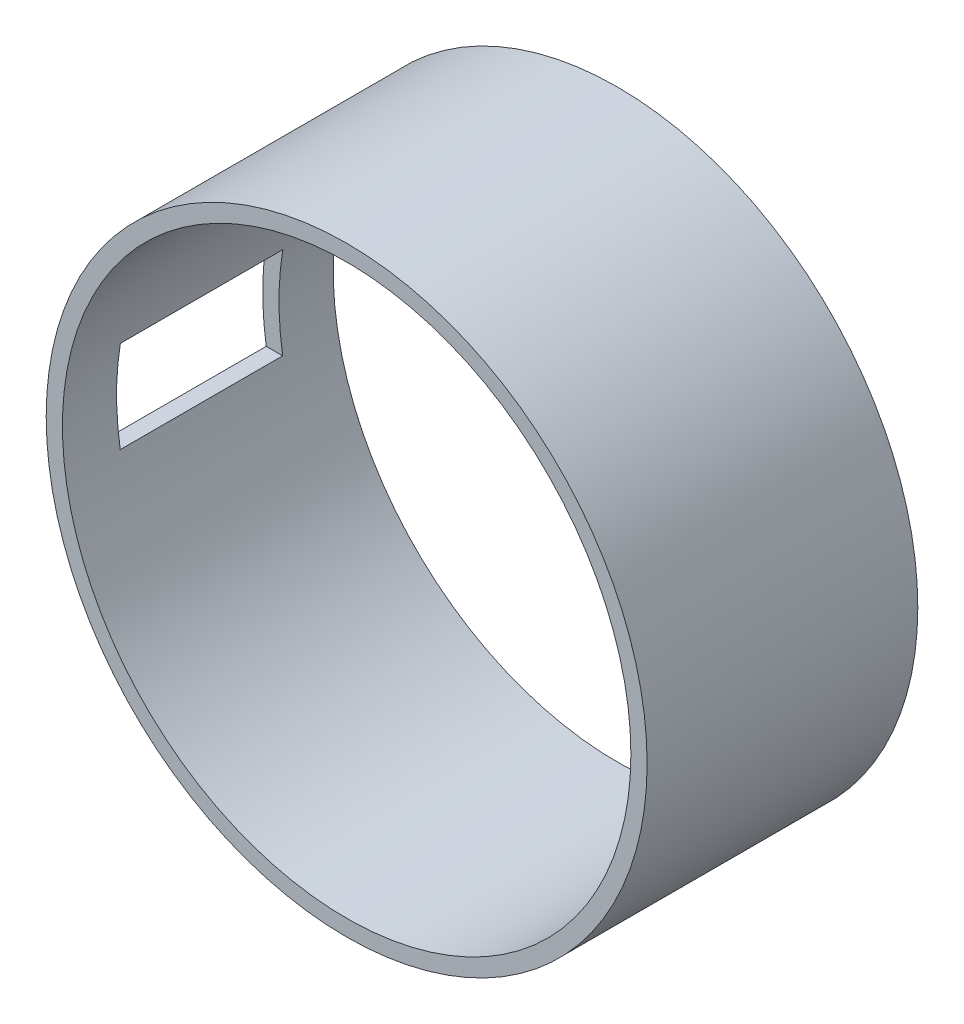
ISO-10303-21;
HEADER;
FILE_DESCRIPTION(('STEP AP214'),'2;1');
FILE_NAME('part.step','',(''),(''),'','','');
FILE_SCHEMA(('AUTOMOTIVE_DESIGN { 1 0 10303 214 1 1 1 1 }'));
ENDSEC;
DATA;
#1=APPLICATION_CONTEXT('core data for automotive mechanical design processes');
#2=APPLICATION_PROTOCOL_DEFINITION('international standard','automotive_design',2000,#1);
#3=PRODUCT_CONTEXT('',#1,'mechanical');
#4=PRODUCT('Part','Part','',(#3));
#5=PRODUCT_RELATED_PRODUCT_CATEGORY('part','',(#4));
#6=PRODUCT_DEFINITION_FORMATION('','',#4);
#7=PRODUCT_DEFINITION_CONTEXT('part definition',#1,'design');
#8=PRODUCT_DEFINITION('design','',#6,#7);
#9=PRODUCT_DEFINITION_SHAPE('','',#8);
#10=(LENGTH_UNIT() NAMED_UNIT(*) SI_UNIT(.MILLI.,.METRE.));
#11=(NAMED_UNIT(*) PLANE_ANGLE_UNIT() SI_UNIT($,.RADIAN.));
#12=(NAMED_UNIT(*) SI_UNIT($,.STERADIAN.) SOLID_ANGLE_UNIT());
#13=UNCERTAINTY_MEASURE_WITH_UNIT(LENGTH_MEASURE(1.E-05),#10,'distance_accuracy_value','');
#14=(GEOMETRIC_REPRESENTATION_CONTEXT(3) GLOBAL_UNCERTAINTY_ASSIGNED_CONTEXT((#13)) GLOBAL_UNIT_ASSIGNED_CONTEXT((#10,
#11,#12)) REPRESENTATION_CONTEXT('',''));
#15=CARTESIAN_POINT('',(0.,0.,0.));
#16=DIRECTION('',(0.,0.,1.));
#17=DIRECTION('',(1.,0.,0.));
#18=AXIS2_PLACEMENT_3D('',#15,#16,#17);
#19=CARTESIAN_POINT('',(0.,0.,10.));
#20=DIRECTION('',(0.,0.,1.));
#21=DIRECTION('',(1.,0.,0.));
#22=AXIS2_PLACEMENT_3D('',#19,#20,#21);
#23=PLANE('',#22);
#24=CARTESIAN_POINT('',(0.,0.,10.));
#25=DIRECTION('',(0.,0.,1.));
#26=DIRECTION('',(1.,0.,0.));
#27=AXIS2_PLACEMENT_3D('',#24,#25,#26);
#28=CIRCLE('',#27,11.1);
#29=CARTESIAN_POINT('',(11.1,0.,10.));
#30=VERTEX_POINT('',#29);
#31=EDGE_CURVE('E91',#30,#30,#28,.T.);
#32=ORIENTED_EDGE('',*,*,#31,.T.);
#33=EDGE_LOOP('',(#32));
#34=FACE_BOUND('',#33,.T.);
#35=CARTESIAN_POINT('',(0.,0.,10.));
#36=DIRECTION('',(0.,0.,1.));
#37=DIRECTION('',(1.,0.,0.));
#38=AXIS2_PLACEMENT_3D('',#35,#36,#37);
#39=CIRCLE('',#38,10.5);
#40=CARTESIAN_POINT('',(10.5,0.,10.));
#41=VERTEX_POINT('',#40);
#42=EDGE_CURVE('E115',#41,#41,#39,.T.);
#43=ORIENTED_EDGE('',*,*,#42,.F.);
#44=EDGE_LOOP('',(#43));
#45=FACE_BOUND('',#44,.T.);
#46=ADVANCED_FACE('F45',(#34,#45),#23,.T.);
#47=CARTESIAN_POINT('',(0.,0.,0.));
#48=DIRECTION('',(0.,0.,1.));
#49=DIRECTION('',(1.,0.,0.));
#50=AXIS2_PLACEMENT_3D('',#47,#48,#49);
#51=PLANE('',#50);
#52=CARTESIAN_POINT('',(0.,0.,0.));
#53=DIRECTION('',(0.,0.,1.));
#54=DIRECTION('',(1.,0.,0.));
#55=AXIS2_PLACEMENT_3D('',#52,#53,#54);
#56=CIRCLE('',#55,11.1);
#57=CARTESIAN_POINT('',(11.1,0.,0.));
#58=VERTEX_POINT('',#57);
#59=EDGE_CURVE('E111',#58,#58,#56,.T.);
#60=ORIENTED_EDGE('',*,*,#59,.F.);
#61=EDGE_LOOP('',(#60));
#62=FACE_BOUND('',#61,.T.);
#63=CARTESIAN_POINT('',(0.,0.,0.));
#64=DIRECTION('',(0.,0.,1.));
#65=DIRECTION('',(1.,0.,0.));
#66=AXIS2_PLACEMENT_3D('',#63,#64,#65);
#67=CIRCLE('',#66,10.5);
#68=CARTESIAN_POINT('',(10.5,0.,0.));
#69=VERTEX_POINT('',#68);
#70=EDGE_CURVE('E119',#69,#69,#67,.T.);
#71=ORIENTED_EDGE('',*,*,#70,.T.);
#72=EDGE_LOOP('',(#71));
#73=FACE_BOUND('',#72,.T.);
#74=ADVANCED_FACE('F160',(#62,#73),#51,.F.);
#75=CARTESIAN_POINT('',(0.,0.,10.));
#76=DIRECTION('',(0.,0.,-1.));
#77=DIRECTION('',(-1.,0.,0.));
#78=AXIS2_PLACEMENT_3D('',#75,#76,#77);
#79=CYLINDRICAL_SURFACE('',#78,11.1);
#80=DIRECTION('',(0.,0.,-1.));
#81=VECTOR('',#80,1.);
#82=CARTESIAN_POINT('',(-10.966736898626,1.71484162426612,10.));
#83=LINE('',#82,#81);
#84=CARTESIAN_POINT('',(-10.966736898626,1.71484162426612,2.));
#85=VERTEX_POINT('',#84);
#86=CARTESIAN_POINT('',(-10.966736898626,1.71484162426612,8.));
#87=VERTEX_POINT('',#86);
#88=EDGE_CURVE('E128',#85,#87,#83,.F.);
#89=ORIENTED_EDGE('',*,*,#88,.T.);
#90=CARTESIAN_POINT('',(0.,0.,8.));
#91=DIRECTION('',(0.,0.,1.));
#92=DIRECTION('',(1.,0.,0.));
#93=AXIS2_PLACEMENT_3D('',#90,#91,#92);
#94=CIRCLE('',#93,11.1);
#95=CARTESIAN_POINT('',(-10.9713372589076,-1.68515837573388,8.));
#96=VERTEX_POINT('',#95);
#97=EDGE_CURVE('E132',#87,#96,#94,.T.);
#98=ORIENTED_EDGE('',*,*,#97,.T.);
#99=DIRECTION('',(0.,0.,-1.));
#100=VECTOR('',#99,1.);
#101=CARTESIAN_POINT('',(-10.9713372589076,-1.68515837573388,10.));
#102=LINE('',#101,#100);
#103=CARTESIAN_POINT('',(-10.9713372589076,-1.68515837573388,2.));
#104=VERTEX_POINT('',#103);
#105=EDGE_CURVE('E135',#96,#104,#102,.T.);
#106=ORIENTED_EDGE('',*,*,#105,.T.);
#107=CARTESIAN_POINT('',(0.,0.,2.));
#108=DIRECTION('',(0.,0.,-1.));
#109=DIRECTION('',(0.,1.,0.));
#110=AXIS2_PLACEMENT_3D('',#107,#108,#109);
#111=CIRCLE('',#110,11.1);
#112=EDGE_CURVE('E97',#104,#85,#111,.T.);
#113=ORIENTED_EDGE('',*,*,#112,.T.);
#114=EDGE_LOOP('',(#89,#98,#106,#113));
#115=FACE_BOUND('',#114,.T.);
#116=ORIENTED_EDGE('',*,*,#31,.F.);
#117=EDGE_LOOP('',(#116));
#118=FACE_BOUND('',#117,.T.);
#119=ORIENTED_EDGE('',*,*,#59,.T.);
#120=EDGE_LOOP('',(#119));
#121=FACE_BOUND('',#120,.T.);
#122=ADVANCED_FACE('F47',(#115,#118,#121),#79,.T.);
#123=CARTESIAN_POINT('',(0.,0.,10.));
#124=DIRECTION('',(0.,0.,-1.));
#125=DIRECTION('',(-1.,0.,0.));
#126=AXIS2_PLACEMENT_3D('',#123,#124,#125);
#127=CYLINDRICAL_SURFACE('',#126,10.5);
#128=CARTESIAN_POINT('',(0.,0.,2.));
#129=DIRECTION('',(0.,0.,-1.));
#130=DIRECTION('',(0.,1.,0.));
#131=AXIS2_PLACEMENT_3D('',#128,#129,#130);
#132=CIRCLE('',#131,10.5);
#133=CARTESIAN_POINT('',(-10.3638912213847,-1.68515837573388,2.));
#134=VERTEX_POINT('',#133);
#135=CARTESIAN_POINT('',(-10.3590211025794,1.71484162426612,2.));
#136=VERTEX_POINT('',#135);
#137=EDGE_CURVE('E11',#134,#136,#132,.T.);
#138=ORIENTED_EDGE('',*,*,#137,.F.);
#139=DIRECTION('',(0.,0.,-1.));
#140=VECTOR('',#139,1.);
#141=CARTESIAN_POINT('',(-10.3638912213847,-1.68515837573388,10.));
#142=LINE('',#141,#140);
#143=CARTESIAN_POINT('',(-10.3638912213847,-1.68515837573388,8.));
#144=VERTEX_POINT('',#143);
#145=EDGE_CURVE('E84',#144,#134,#142,.T.);
#146=ORIENTED_EDGE('',*,*,#145,.F.);
#147=CARTESIAN_POINT('',(0.,0.,8.));
#148=DIRECTION('',(0.,0.,1.));
#149=DIRECTION('',(1.,0.,0.));
#150=AXIS2_PLACEMENT_3D('',#147,#148,#149);
#151=CIRCLE('',#150,10.5);
#152=CARTESIAN_POINT('',(-10.3590211025794,1.71484162426612,8.));
#153=VERTEX_POINT('',#152);
#154=EDGE_CURVE('E90',#153,#144,#151,.T.);
#155=ORIENTED_EDGE('',*,*,#154,.F.);
#156=DIRECTION('',(0.,0.,-1.));
#157=VECTOR('',#156,1.);
#158=CARTESIAN_POINT('',(-10.3590211025794,1.71484162426612,10.));
#159=LINE('',#158,#157);
#160=EDGE_CURVE('E54',#136,#153,#159,.F.);
#161=ORIENTED_EDGE('',*,*,#160,.F.);
#162=EDGE_LOOP('',(#138,#146,#155,#161));
#163=FACE_BOUND('',#162,.T.);
#164=ORIENTED_EDGE('',*,*,#42,.T.);
#165=EDGE_LOOP('',(#164));
#166=FACE_BOUND('',#165,.T.);
#167=ORIENTED_EDGE('',*,*,#70,.F.);
#168=EDGE_LOOP('',(#167));
#169=FACE_BOUND('',#168,.T.);
#170=ADVANCED_FACE('F102',(#163,#166,#169),#127,.F.);
#171=CARTESIAN_POINT('',(-9.6,1.71484162426612,2.));
#172=DIRECTION('',(0.,0.,-1.));
#173=DIRECTION('',(0.,1.,0.));
#174=AXIS2_PLACEMENT_3D('',#171,#172,#173);
#175=PLANE('',#174);
#176=DIRECTION('',(-1.,0.,0.));
#177=VECTOR('',#176,1.);
#178=CARTESIAN_POINT('',(-9.6,-1.68515837573388,2.));
#179=LINE('',#178,#177);
#180=EDGE_CURVE('E61',#134,#104,#179,.T.);
#181=ORIENTED_EDGE('',*,*,#180,.F.);
#182=ORIENTED_EDGE('',*,*,#137,.T.);
#183=DIRECTION('',(-1.,0.,0.));
#184=VECTOR('',#183,1.);
#185=CARTESIAN_POINT('',(-9.6,1.71484162426612,2.));
#186=LINE('',#185,#184);
#187=EDGE_CURVE('E137',#136,#85,#186,.T.);
#188=ORIENTED_EDGE('',*,*,#187,.T.);
#189=ORIENTED_EDGE('',*,*,#112,.F.);
#190=EDGE_LOOP('',(#181,#182,#188,#189));
#191=FACE_BOUND('',#190,.T.);
#192=ADVANCED_FACE('F94',(#191),#175,.F.);
#193=CARTESIAN_POINT('',(-9.6,1.71484162426612,2.));
#194=DIRECTION('',(0.,1.,0.));
#195=DIRECTION('',(0.,0.,1.));
#196=AXIS2_PLACEMENT_3D('',#193,#194,#195);
#197=PLANE('',#196);
#198=ORIENTED_EDGE('',*,*,#187,.F.);
#199=ORIENTED_EDGE('',*,*,#160,.T.);
#200=DIRECTION('',(-1.,0.,0.));
#201=VECTOR('',#200,1.);
#202=CARTESIAN_POINT('',(-9.6,1.71484162426612,8.));
#203=LINE('',#202,#201);
#204=EDGE_CURVE('E141',#153,#87,#203,.T.);
#205=ORIENTED_EDGE('',*,*,#204,.T.);
#206=ORIENTED_EDGE('',*,*,#88,.F.);
#207=EDGE_LOOP('',(#198,#199,#205,#206));
#208=FACE_BOUND('',#207,.T.);
#209=ADVANCED_FACE('F146',(#208),#197,.F.);
#210=CARTESIAN_POINT('',(-9.6,1.71484162426612,8.));
#211=DIRECTION('',(0.,0.,1.));
#212=DIRECTION('',(1.,0.,0.));
#213=AXIS2_PLACEMENT_3D('',#210,#211,#212);
#214=PLANE('',#213);
#215=ORIENTED_EDGE('',*,*,#204,.F.);
#216=ORIENTED_EDGE('',*,*,#154,.T.);
#217=DIRECTION('',(-1.,0.,0.));
#218=VECTOR('',#217,1.);
#219=CARTESIAN_POINT('',(-9.6,-1.68515837573388,8.));
#220=LINE('',#219,#218);
#221=EDGE_CURVE('E66',#144,#96,#220,.T.);
#222=ORIENTED_EDGE('',*,*,#221,.T.);
#223=ORIENTED_EDGE('',*,*,#97,.F.);
#224=EDGE_LOOP('',(#215,#216,#222,#223));
#225=FACE_BOUND('',#224,.T.);
#226=ADVANCED_FACE('F150',(#225),#214,.F.);
#227=CARTESIAN_POINT('',(-9.6,-1.68515837573388,2.));
#228=DIRECTION('',(0.,-1.,0.));
#229=DIRECTION('',(0.,0.,-1.));
#230=AXIS2_PLACEMENT_3D('',#227,#228,#229);
#231=PLANE('',#230);
#232=ORIENTED_EDGE('',*,*,#221,.F.);
#233=ORIENTED_EDGE('',*,*,#145,.T.);
#234=ORIENTED_EDGE('',*,*,#180,.T.);
#235=ORIENTED_EDGE('',*,*,#105,.F.);
#236=EDGE_LOOP('',(#232,#233,#234,#235));
#237=FACE_BOUND('',#236,.T.);
#238=ADVANCED_FACE('F85',(#237),#231,.F.);
#239=CLOSED_SHELL('',(#46,#74,#122,#170,#192,#209,#226,#238));
#240=MANIFOLD_SOLID_BREP('B2',#239);
#241=ADVANCED_BREP_SHAPE_REPRESENTATION('',(#18,#240),#14);
#242=SHAPE_DEFINITION_REPRESENTATION(#9,#241);
ENDSEC;
END-ISO-10303-21;
